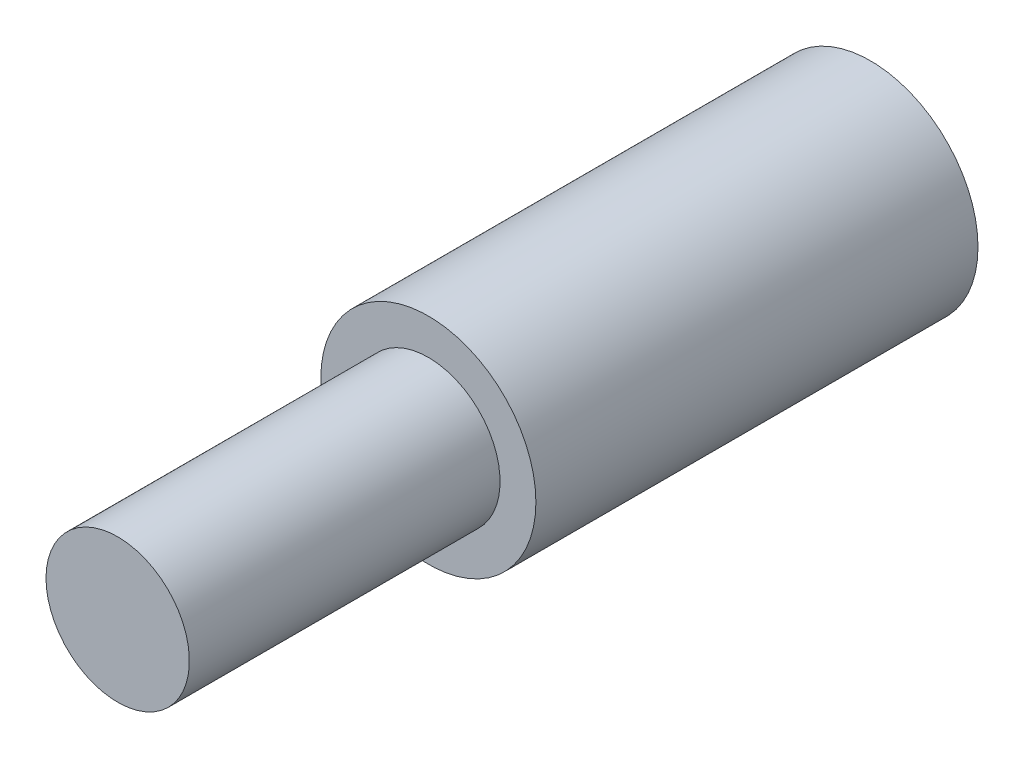
ISO-10303-21;
HEADER;
FILE_DESCRIPTION(('STEP AP214'),'2;1');
FILE_NAME('part.step','',(''),(''),'','','');
FILE_SCHEMA(('AUTOMOTIVE_DESIGN { 1 0 10303 214 1 1 1 1 }'));
ENDSEC;
DATA;
#1=APPLICATION_CONTEXT('core data for automotive mechanical design processes');
#2=APPLICATION_PROTOCOL_DEFINITION('international standard','automotive_design',2000,#1);
#3=PRODUCT_CONTEXT('',#1,'mechanical');
#4=PRODUCT('Part','Part','',(#3));
#5=PRODUCT_RELATED_PRODUCT_CATEGORY('part','',(#4));
#6=PRODUCT_DEFINITION_FORMATION('','',#4);
#7=PRODUCT_DEFINITION_CONTEXT('part definition',#1,'design');
#8=PRODUCT_DEFINITION('design','',#6,#7);
#9=PRODUCT_DEFINITION_SHAPE('','',#8);
#10=(LENGTH_UNIT() NAMED_UNIT(*) SI_UNIT(.MILLI.,.METRE.));
#11=(NAMED_UNIT(*) PLANE_ANGLE_UNIT() SI_UNIT($,.RADIAN.));
#12=(NAMED_UNIT(*) SI_UNIT($,.STERADIAN.) SOLID_ANGLE_UNIT());
#13=UNCERTAINTY_MEASURE_WITH_UNIT(LENGTH_MEASURE(1.E-05),#10,'distance_accuracy_value','');
#14=(GEOMETRIC_REPRESENTATION_CONTEXT(3) GLOBAL_UNCERTAINTY_ASSIGNED_CONTEXT((#13)) GLOBAL_UNIT_ASSIGNED_CONTEXT((#10,
#11,#12)) REPRESENTATION_CONTEXT('',''));
#15=CARTESIAN_POINT('',(0.,0.,0.));
#16=DIRECTION('',(0.,0.,1.));
#17=DIRECTION('',(1.,0.,0.));
#18=AXIS2_PLACEMENT_3D('',#15,#16,#17);
#19=CARTESIAN_POINT('',(0.,0.,37.));
#20=DIRECTION('',(0.,0.,-1.));
#21=DIRECTION('',(-1.,0.,0.));
#22=AXIS2_PLACEMENT_3D('',#19,#20,#21);
#23=CYLINDRICAL_SURFACE('',#22,9.);
#24=CARTESIAN_POINT('',(0.,0.,37.));
#25=DIRECTION('',(0.,0.,1.));
#26=DIRECTION('',(1.,0.,0.));
#27=AXIS2_PLACEMENT_3D('',#24,#25,#26);
#28=CIRCLE('',#27,9.);
#29=CARTESIAN_POINT('',(9.,0.,37.));
#30=VERTEX_POINT('',#29);
#31=EDGE_CURVE('E39',#30,#30,#28,.T.);
#32=ORIENTED_EDGE('',*,*,#31,.F.);
#33=EDGE_LOOP('',(#32));
#34=FACE_BOUND('',#33,.T.);
#35=CARTESIAN_POINT('',(0.,0.,0.));
#36=DIRECTION('',(0.,0.,1.));
#37=DIRECTION('',(1.,0.,0.));
#38=AXIS2_PLACEMENT_3D('',#35,#36,#37);
#39=CIRCLE('',#38,9.);
#40=CARTESIAN_POINT('',(9.,0.,0.));
#41=VERTEX_POINT('',#40);
#42=EDGE_CURVE('E35',#41,#41,#39,.T.);
#43=ORIENTED_EDGE('',*,*,#42,.T.);
#44=EDGE_LOOP('',(#43));
#45=FACE_BOUND('',#44,.T.);
#46=ADVANCED_FACE('F32',(#34,#45),#23,.T.);
#47=CARTESIAN_POINT('',(0.,0.,37.));
#48=DIRECTION('',(0.,0.,1.));
#49=DIRECTION('',(1.,0.,0.));
#50=AXIS2_PLACEMENT_3D('',#47,#48,#49);
#51=PLANE('',#50);
#52=CARTESIAN_POINT('',(0.,0.,37.));
#53=DIRECTION('',(0.,0.,1.));
#54=DIRECTION('',(1.,0.,0.));
#55=AXIS2_PLACEMENT_3D('',#52,#53,#54);
#56=CIRCLE('',#55,6.);
#57=CARTESIAN_POINT('',(-6.,0.,37.));
#58=VERTEX_POINT('',#57);
#59=EDGE_CURVE('E10',#58,#58,#56,.T.);
#60=ORIENTED_EDGE('',*,*,#59,.F.);
#61=EDGE_LOOP('',(#60));
#62=FACE_BOUND('',#61,.T.);
#63=ORIENTED_EDGE('',*,*,#31,.T.);
#64=EDGE_LOOP('',(#63));
#65=FACE_BOUND('',#64,.T.);
#66=ADVANCED_FACE('F56',(#62,#65),#51,.T.);
#67=CARTESIAN_POINT('',(0.,0.,0.));
#68=DIRECTION('',(0.,0.,1.));
#69=DIRECTION('',(1.,0.,0.));
#70=AXIS2_PLACEMENT_3D('',#67,#68,#69);
#71=PLANE('',#70);
#72=ORIENTED_EDGE('',*,*,#42,.F.);
#73=EDGE_LOOP('',(#72));
#74=FACE_BOUND('',#73,.T.);
#75=ADVANCED_FACE('F53',(#74),#71,.F.);
#76=CARTESIAN_POINT('',(0.,0.,63.));
#77=DIRECTION('',(0.,0.,-1.));
#78=DIRECTION('',(-1.,0.,0.));
#79=AXIS2_PLACEMENT_3D('',#76,#77,#78);
#80=CYLINDRICAL_SURFACE('',#79,6.);
#81=CARTESIAN_POINT('',(0.,0.,63.));
#82=DIRECTION('',(0.,0.,1.));
#83=DIRECTION('',(1.,0.,0.));
#84=AXIS2_PLACEMENT_3D('',#81,#82,#83);
#85=CIRCLE('',#84,6.);
#86=CARTESIAN_POINT('',(-6.,0.,63.));
#87=VERTEX_POINT('',#86);
#88=EDGE_CURVE('E45',#87,#87,#85,.T.);
#89=CARTESIAN_POINT('',(-6.,0.,63.));
#90=CARTESIAN_POINT('',(-6.,0.,62.7291666666667));
#91=CARTESIAN_POINT('',(-6.,0.,62.4583333333333));
#92=CARTESIAN_POINT('',(-6.,0.,61.9166666666667));
#93=CARTESIAN_POINT('',(-6.,0.,61.6458333333333));
#94=CARTESIAN_POINT('',(-6.,0.,61.1041666666667));
#95=CARTESIAN_POINT('',(-6.,0.,60.8333333333333));
#96=CARTESIAN_POINT('',(-6.,0.,60.2916666666667));
#97=CARTESIAN_POINT('',(-6.,0.,60.0208333333333));
#98=CARTESIAN_POINT('',(-6.,0.,59.4791666666667));
#99=CARTESIAN_POINT('',(-6.,0.,59.2083333333333));
#100=CARTESIAN_POINT('',(-6.,0.,58.6666666666667));
#101=CARTESIAN_POINT('',(-6.,0.,58.3958333333333));
#102=CARTESIAN_POINT('',(-6.,0.,57.8541666666667));
#103=CARTESIAN_POINT('',(-6.,0.,57.5833333333333));
#104=CARTESIAN_POINT('',(-6.,0.,57.0416666666667));
#105=CARTESIAN_POINT('',(-6.,0.,56.7708333333333));
#106=CARTESIAN_POINT('',(-6.,0.,56.2291666666667));
#107=CARTESIAN_POINT('',(-6.,0.,55.9583333333333));
#108=CARTESIAN_POINT('',(-6.,0.,55.4166666666667));
#109=CARTESIAN_POINT('',(-6.,0.,55.1458333333333));
#110=CARTESIAN_POINT('',(-6.,0.,54.6041666666667));
#111=CARTESIAN_POINT('',(-6.,0.,54.3333333333333));
#112=CARTESIAN_POINT('',(-6.,0.,53.7916666666667));
#113=CARTESIAN_POINT('',(-6.,0.,53.5208333333333));
#114=CARTESIAN_POINT('',(-6.,0.,52.9791666666667));
#115=CARTESIAN_POINT('',(-6.,0.,52.7083333333333));
#116=CARTESIAN_POINT('',(-6.,0.,52.1666666666667));
#117=CARTESIAN_POINT('',(-6.,0.,51.8958333333333));
#118=CARTESIAN_POINT('',(-6.,0.,51.3541666666667));
#119=CARTESIAN_POINT('',(-6.,0.,51.0833333333333));
#120=CARTESIAN_POINT('',(-6.,0.,50.5416666666667));
#121=CARTESIAN_POINT('',(-6.,0.,50.2708333333333));
#122=CARTESIAN_POINT('',(-6.,0.,49.7291666666667));
#123=CARTESIAN_POINT('',(-6.,0.,49.4583333333333));
#124=CARTESIAN_POINT('',(-6.,0.,48.9166666666667));
#125=CARTESIAN_POINT('',(-6.,0.,48.6458333333333));
#126=CARTESIAN_POINT('',(-6.,0.,48.1041666666667));
#127=CARTESIAN_POINT('',(-6.,0.,47.8333333333333));
#128=CARTESIAN_POINT('',(-6.,0.,47.2916666666667));
#129=CARTESIAN_POINT('',(-6.,0.,47.0208333333333));
#130=CARTESIAN_POINT('',(-6.,0.,46.4791666666667));
#131=CARTESIAN_POINT('',(-6.,0.,46.2083333333333));
#132=CARTESIAN_POINT('',(-6.,0.,45.6666666666667));
#133=CARTESIAN_POINT('',(-6.,0.,45.3958333333333));
#134=CARTESIAN_POINT('',(-6.,0.,44.8541666666667));
#135=CARTESIAN_POINT('',(-6.,0.,44.5833333333333));
#136=CARTESIAN_POINT('',(-6.,0.,44.0416666666667));
#137=CARTESIAN_POINT('',(-6.,0.,43.7708333333333));
#138=CARTESIAN_POINT('',(-6.,0.,43.2291666666667));
#139=CARTESIAN_POINT('',(-6.,0.,42.9583333333333));
#140=CARTESIAN_POINT('',(-6.,0.,42.4166666666667));
#141=CARTESIAN_POINT('',(-6.,0.,42.1458333333333));
#142=CARTESIAN_POINT('',(-6.,0.,41.6041666666667));
#143=CARTESIAN_POINT('',(-6.,0.,41.3333333333333));
#144=CARTESIAN_POINT('',(-6.,0.,40.7916666666667));
#145=CARTESIAN_POINT('',(-6.,0.,40.5208333333333));
#146=CARTESIAN_POINT('',(-6.,0.,39.9791666666667));
#147=CARTESIAN_POINT('',(-6.,0.,39.7083333333333));
#148=CARTESIAN_POINT('',(-6.,0.,39.1666666666667));
#149=CARTESIAN_POINT('',(-6.,0.,38.8958333333333));
#150=CARTESIAN_POINT('',(-6.,0.,38.3541666666667));
#151=CARTESIAN_POINT('',(-6.,0.,38.0833333333333));
#152=CARTESIAN_POINT('',(-6.,0.,37.5416666666667));
#153=CARTESIAN_POINT('',(-6.,0.,37.2708333333333));
#154=CARTESIAN_POINT('',(-6.,0.,37.));
#155=B_SPLINE_CURVE_WITH_KNOTS('',3,(#89,#90,#91,#92,#93,#94,#95,#96,#97,#98,#99,#100,#101,#102,
#103,#104,#105,#106,#107,#108,#109,#110,#111,#112,#113,#114,#115,#116,#117,#118,#119,#120,#121,
#122,#123,#124,#125,#126,#127,#128,#129,#130,#131,#132,#133,#134,#135,#136,#137,#138,#139,#140,
#141,#142,#143,#144,#145,#146,#147,#148,#149,#150,#151,#152,#153,#154),.UNSPECIFIED.,.F.,.F.,(4,
2,2,2,2,2,2,2,2,2,2,2,2,2,2,2,2,2,2,2,2,2,2,2,2,2,2,2,2,2,2,2,4),(0.,0.812500000000008,
1.62500000000001,2.43750000000001,3.25000000000001,4.0625,4.875,5.68750000000001,
6.50000000000001,7.31250000000001,8.12500000000001,8.93750000000001,9.75000000000001,10.5625,
11.375,12.1875,13.,13.8125,14.625,15.4375,16.25,17.0625,17.875,18.6875,19.5,20.3125,21.125,
21.9375,22.75,23.5625,24.375,25.1875,26.),.UNSPECIFIED.);
#156=EDGE_CURVE('BSEAM55',#87,#58,#155,.T.);
#157=ORIENTED_EDGE('',*,*,#88,.F.);
#158=ORIENTED_EDGE('',*,*,#59,.T.);
#159=ORIENTED_EDGE('',*,*,#156,.T.);
#160=ORIENTED_EDGE('',*,*,#156,.F.);
#161=EDGE_LOOP('',(#157,#159,#158,#160));
#162=FACE_BOUND('',#161,.T.);
#163=ADVANCED_FACE('F55',(#162),#80,.T.);
#164=CARTESIAN_POINT('',(0.,0.,63.));
#165=DIRECTION('',(0.,0.,1.));
#166=DIRECTION('',(1.,0.,0.));
#167=AXIS2_PLACEMENT_3D('',#164,#165,#166);
#168=PLANE('',#167);
#169=ORIENTED_EDGE('',*,*,#88,.T.);
#170=EDGE_LOOP('',(#169));
#171=FACE_BOUND('',#170,.T.);
#172=ADVANCED_FACE('F61',(#171),#168,.T.);
#173=CLOSED_SHELL('',(#46,#66,#75,#163,#172));
#174=MANIFOLD_SOLID_BREP('B2',#173);
#175=ADVANCED_BREP_SHAPE_REPRESENTATION('',(#18,#174),#14);
#176=SHAPE_DEFINITION_REPRESENTATION(#9,#175);
ENDSEC;
END-ISO-10303-21;
